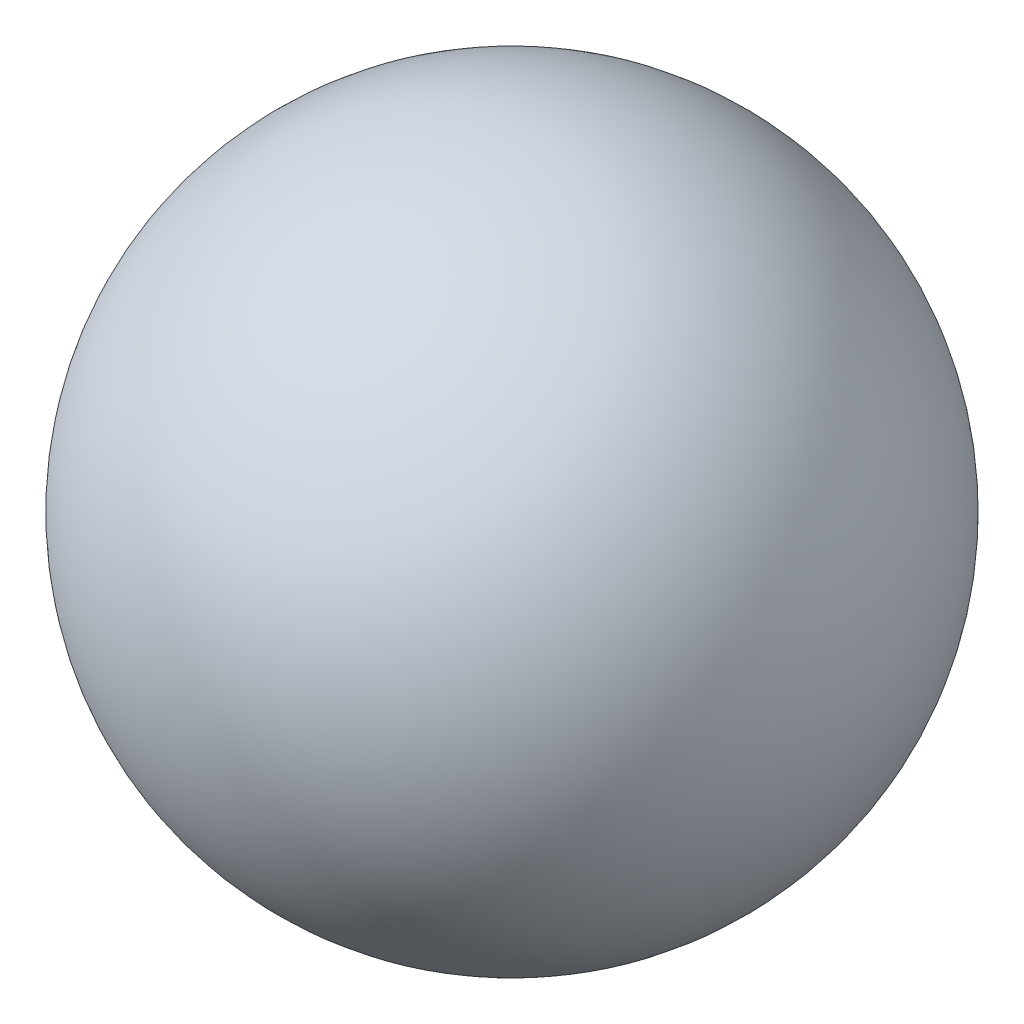
ISO-10303-21;
HEADER;
FILE_DESCRIPTION(('STEP AP214'),'2;1');
FILE_NAME('part.step','',(''),(''),'','','');
FILE_SCHEMA(('AUTOMOTIVE_DESIGN { 1 0 10303 214 1 1 1 1 }'));
ENDSEC;
DATA;
#1=APPLICATION_CONTEXT('core data for automotive mechanical design processes');
#2=APPLICATION_PROTOCOL_DEFINITION('international standard','automotive_design',2000,#1);
#3=PRODUCT_CONTEXT('',#1,'mechanical');
#4=PRODUCT('Part','Part','',(#3));
#5=PRODUCT_RELATED_PRODUCT_CATEGORY('part','',(#4));
#6=PRODUCT_DEFINITION_FORMATION('','',#4);
#7=PRODUCT_DEFINITION_CONTEXT('part definition',#1,'design');
#8=PRODUCT_DEFINITION('design','',#6,#7);
#9=PRODUCT_DEFINITION_SHAPE('','',#8);
#10=(LENGTH_UNIT() NAMED_UNIT(*) SI_UNIT(.MILLI.,.METRE.));
#11=(NAMED_UNIT(*) PLANE_ANGLE_UNIT() SI_UNIT($,.RADIAN.));
#12=(NAMED_UNIT(*) SI_UNIT($,.STERADIAN.) SOLID_ANGLE_UNIT());
#13=UNCERTAINTY_MEASURE_WITH_UNIT(LENGTH_MEASURE(1.E-05),#10,'distance_accuracy_value','');
#14=(GEOMETRIC_REPRESENTATION_CONTEXT(3) GLOBAL_UNCERTAINTY_ASSIGNED_CONTEXT((#13)) GLOBAL_UNIT_ASSIGNED_CONTEXT((#10,
#11,#12)) REPRESENTATION_CONTEXT('',''));
#15=CARTESIAN_POINT('',(0.,0.,0.));
#16=DIRECTION('',(0.,0.,1.));
#17=DIRECTION('',(1.,0.,0.));
#18=AXIS2_PLACEMENT_3D('',#15,#16,#17);
#19=CARTESIAN_POINT('',(0.,0.,0.));
#20=DIRECTION('',(0.,-1.,0.));
#21=DIRECTION('',(-1.,0.,0.));
#22=AXIS2_PLACEMENT_3D('',#19,#20,#21);
#23=SPHERICAL_SURFACE('',#22,12.);
#24=CARTESIAN_POINT('',(0.,-12.,0.));
#25=VERTEX_POINT('',#24);
#26=VERTEX_LOOP('',#25);
#27=FACE_BOUND('',#26,.T.);
#28=ADVANCED_FACE('F33',(#27),#23,.T.);
#29=CLOSED_SHELL('',(#28));
#30=MANIFOLD_SOLID_BREP('B2',#29);
#31=ADVANCED_BREP_SHAPE_REPRESENTATION('',(#18,#30),#14);
#32=SHAPE_DEFINITION_REPRESENTATION(#9,#31);
ENDSEC;
END-ISO-10303-21;
